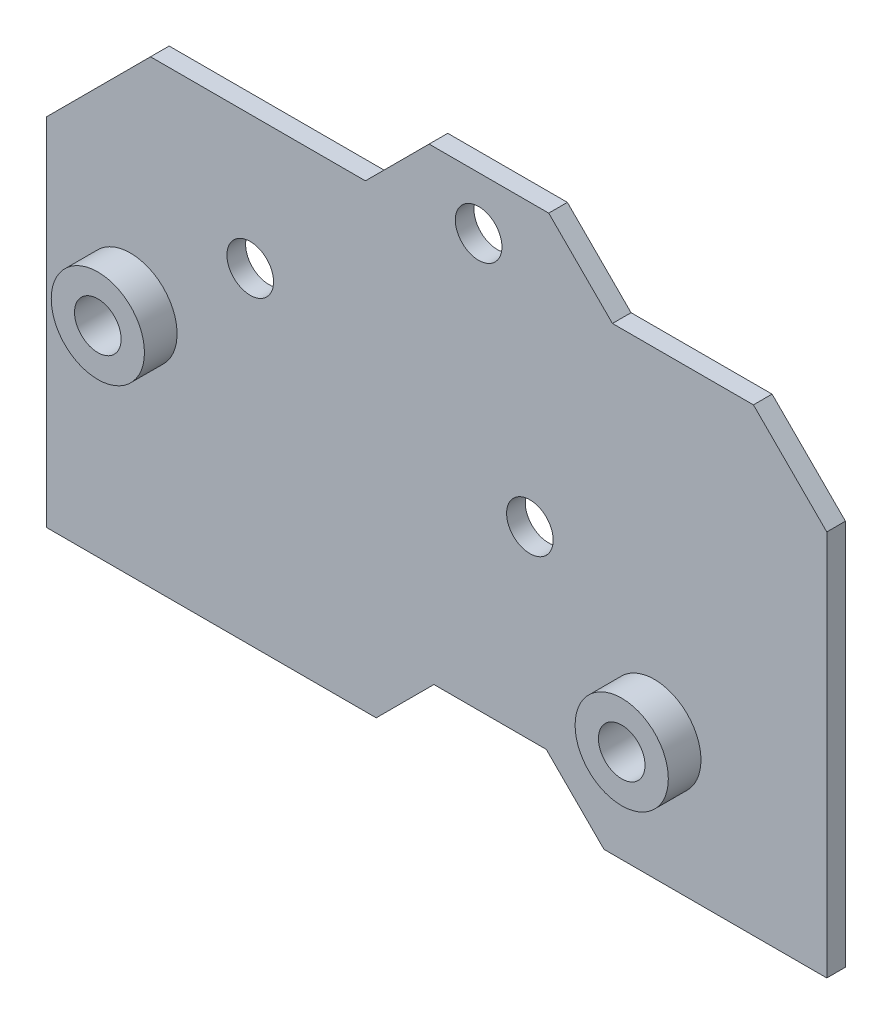
ISO-10303-21;
HEADER;
FILE_DESCRIPTION(('STEP AP214'),'2;1');
FILE_NAME('part.step','',(''),(''),'','','');
FILE_SCHEMA(('AUTOMOTIVE_DESIGN { 1 0 10303 214 1 1 1 1 }'));
ENDSEC;
DATA;
#1=APPLICATION_CONTEXT('core data for automotive mechanical design processes');
#2=APPLICATION_PROTOCOL_DEFINITION('international standard','automotive_design',2000,#1);
#3=PRODUCT_CONTEXT('',#1,'mechanical');
#4=PRODUCT('Part','Part','',(#3));
#5=PRODUCT_RELATED_PRODUCT_CATEGORY('part','',(#4));
#6=PRODUCT_DEFINITION_FORMATION('','',#4);
#7=PRODUCT_DEFINITION_CONTEXT('part definition',#1,'design');
#8=PRODUCT_DEFINITION('design','',#6,#7);
#9=PRODUCT_DEFINITION_SHAPE('','',#8);
#10=(LENGTH_UNIT() NAMED_UNIT(*) SI_UNIT(.MILLI.,.METRE.));
#11=(NAMED_UNIT(*) PLANE_ANGLE_UNIT() SI_UNIT($,.RADIAN.));
#12=(NAMED_UNIT(*) SI_UNIT($,.STERADIAN.) SOLID_ANGLE_UNIT());
#13=UNCERTAINTY_MEASURE_WITH_UNIT(LENGTH_MEASURE(1.E-05),#10,'distance_accuracy_value','');
#14=(GEOMETRIC_REPRESENTATION_CONTEXT(3) GLOBAL_UNCERTAINTY_ASSIGNED_CONTEXT((#13)) GLOBAL_UNIT_ASSIGNED_CONTEXT((#10,
#11,#12)) REPRESENTATION_CONTEXT('',''));
#15=CARTESIAN_POINT('',(0.,0.,0.));
#16=DIRECTION('',(0.,0.,1.));
#17=DIRECTION('',(1.,0.,0.));
#18=AXIS2_PLACEMENT_3D('',#15,#16,#17);
#19=CARTESIAN_POINT('',(0.,0.,2.));
#20=DIRECTION('',(0.,0.,-1.));
#21=DIRECTION('',(-1.,0.,0.));
#22=AXIS2_PLACEMENT_3D('',#19,#20,#21);
#23=PLANE('',#22);
#24=CARTESIAN_POINT('',(23.3494339703597,-14.,2.));
#25=DIRECTION('',(0.,0.,-1.));
#26=DIRECTION('',(-1.,0.,0.));
#27=AXIS2_PLACEMENT_3D('',#24,#25,#26);
#28=CIRCLE('',#27,5.);
#29=CARTESIAN_POINT('',(18.3494339703597,-14.,2.));
#30=VERTEX_POINT('',#29);
#31=EDGE_CURVE('E11',#30,#30,#28,.F.);
#32=ORIENTED_EDGE('',*,*,#31,.F.);
#33=EDGE_LOOP('',(#32));
#34=FACE_BOUND('',#33,.T.);
#35=CARTESIAN_POINT('',(-32.8494339703597,-2.5,2.));
#36=DIRECTION('',(0.,0.,-1.));
#37=DIRECTION('',(-1.,0.,0.));
#38=AXIS2_PLACEMENT_3D('',#35,#36,#37);
#39=CIRCLE('',#38,5.);
#40=CARTESIAN_POINT('',(-37.8494339703597,-2.5,2.));
#41=VERTEX_POINT('',#40);
#42=EDGE_CURVE('E42',#41,#41,#39,.F.);
#43=ORIENTED_EDGE('',*,*,#42,.F.);
#44=EDGE_LOOP('',(#43));
#45=FACE_BOUND('',#44,.T.);
#46=DIRECTION('',(1.,0.,0.));
#47=VECTOR('',#46,1.);
#48=CARTESIAN_POINT('',(17.9485429782925,-27.5,2.));
#49=LINE('',#48,#47);
#50=CARTESIAN_POINT('',(17.9485429782925,-27.5,2.));
#51=VERTEX_POINT('',#50);
#52=CARTESIAN_POINT('',(41.8494339703597,-27.5,2.));
#53=VERTEX_POINT('',#52);
#54=EDGE_CURVE('E194',#51,#53,#49,.T.);
#55=ORIENTED_EDGE('',*,*,#54,.T.);
#56=DIRECTION('',(0.,1.,0.));
#57=VECTOR('',#56,1.);
#58=CARTESIAN_POINT('',(41.8494339703596,13.9419125392165,2.));
#59=LINE('',#58,#57);
#60=CARTESIAN_POINT('',(41.8494339703596,13.9419125392165,2.));
#61=VERTEX_POINT('',#60);
#62=EDGE_CURVE('E112',#53,#61,#59,.T.);
#63=ORIENTED_EDGE('',*,*,#62,.T.);
#64=DIRECTION('',(-0.707106781186549,0.707106781186546,0.));
#65=VECTOR('',#64,1.);
#66=CARTESIAN_POINT('',(33.9794525217825,21.8118939877936,2.));
#67=LINE('',#66,#65);
#68=CARTESIAN_POINT('',(33.9794525217825,21.8118939877936,2.));
#69=VERTEX_POINT('',#68);
#70=EDGE_CURVE('E299',#61,#69,#67,.T.);
#71=ORIENTED_EDGE('',*,*,#70,.T.);
#72=DIRECTION('',(-1.,0.,0.));
#73=VECTOR('',#72,1.);
#74=CARTESIAN_POINT('',(18.8549246288672,21.8118939877936,2.));
#75=LINE('',#74,#73);
#76=CARTESIAN_POINT('',(18.8549246288672,21.8118939877936,2.));
#77=VERTEX_POINT('',#76);
#78=EDGE_CURVE('E311',#69,#77,#75,.T.);
#79=ORIENTED_EDGE('',*,*,#78,.T.);
#80=DIRECTION('',(-0.707106781186555,0.70710678118654,0.));
#81=VECTOR('',#80,1.);
#82=CARTESIAN_POINT('',(12.0209599922633,28.6458586243974,2.));
#83=LINE('',#82,#81);
#84=CARTESIAN_POINT('',(12.0209599922633,28.6458586243974,2.));
#85=VERTEX_POINT('',#84);
#86=EDGE_CURVE('E308',#77,#85,#83,.T.);
#87=ORIENTED_EDGE('',*,*,#86,.T.);
#88=DIRECTION('',(-1.,0.,0.));
#89=VECTOR('',#88,1.);
#90=CARTESIAN_POINT('',(-0.81185065185721,28.6458586243974,2.));
#91=LINE('',#90,#89);
#92=CARTESIAN_POINT('',(-0.81185065185721,28.6458586243974,2.));
#93=VERTEX_POINT('',#92);
#94=EDGE_CURVE('E310',#85,#93,#91,.T.);
#95=ORIENTED_EDGE('',*,*,#94,.T.);
#96=DIRECTION('',(-0.707106781186542,-0.707106781186553,0.));
#97=VECTOR('',#96,1.);
#98=CARTESIAN_POINT('',(-0.81185065185721,28.6458586243974,2.));
#99=LINE('',#98,#97);
#100=CARTESIAN_POINT('',(-7.64581528846089,21.8118939877936,2.));
#101=VERTEX_POINT('',#100);
#102=EDGE_CURVE('E313',#93,#101,#99,.T.);
#103=ORIENTED_EDGE('',*,*,#102,.T.);
#104=DIRECTION('',(-1.,0.,0.));
#105=VECTOR('',#104,1.);
#106=CARTESIAN_POINT('',(-7.64581528846089,21.8118939877936,2.));
#107=LINE('',#106,#105);
#108=CARTESIAN_POINT('',(-30.6985800545319,21.8118939877936,2.));
#109=VERTEX_POINT('',#108);
#110=EDGE_CURVE('E319',#101,#109,#107,.T.);
#111=ORIENTED_EDGE('',*,*,#110,.T.);
#112=DIRECTION('',(-0.707106781186542,-0.707106781186553,0.));
#113=VECTOR('',#112,1.);
#114=CARTESIAN_POINT('',(-30.6985800545319,21.8118939877936,2.));
#115=LINE('',#114,#113);
#116=CARTESIAN_POINT('',(-41.8494339703597,10.6610400719656,2.));
#117=VERTEX_POINT('',#116);
#118=EDGE_CURVE('E321',#109,#117,#115,.T.);
#119=ORIENTED_EDGE('',*,*,#118,.T.);
#120=DIRECTION('',(0.,-1.,0.));
#121=VECTOR('',#120,1.);
#122=CARTESIAN_POINT('',(-41.8494339703597,10.6610400719656,2.));
#123=LINE('',#122,#121);
#124=CARTESIAN_POINT('',(-41.8494339703597,-27.5,2.));
#125=VERTEX_POINT('',#124);
#126=EDGE_CURVE('E323',#117,#125,#123,.T.);
#127=ORIENTED_EDGE('',*,*,#126,.T.);
#128=DIRECTION('',(1.,0.,0.));
#129=VECTOR('',#128,1.);
#130=CARTESIAN_POINT('',(-41.8494339703597,-27.5,2.));
#131=LINE('',#130,#129);
#132=CARTESIAN_POINT('',(-6.48643568895889,-27.5,2.));
#133=VERTEX_POINT('',#132);
#134=EDGE_CURVE('E149',#125,#133,#131,.T.);
#135=ORIENTED_EDGE('',*,*,#134,.T.);
#136=DIRECTION('',(0.707106781186548,0.707106781186548,0.));
#137=VECTOR('',#136,1.);
#138=CARTESIAN_POINT('',(-6.48643568895889,-27.5,2.));
#139=LINE('',#138,#137);
#140=CARTESIAN_POINT('',(-0.294279728037263,-21.3078440390784,2.));
#141=VERTEX_POINT('',#140);
#142=EDGE_CURVE('E143',#133,#141,#139,.T.);
#143=ORIENTED_EDGE('',*,*,#142,.T.);
#144=DIRECTION('',(1.,0.,0.));
#145=VECTOR('',#144,1.);
#146=CARTESIAN_POINT('',(-0.294279728037263,-21.3078440390784,2.));
#147=LINE('',#146,#145);
#148=CARTESIAN_POINT('',(11.7563870173709,-21.3078440390784,2.));
#149=VERTEX_POINT('',#148);
#150=EDGE_CURVE('E147',#141,#149,#147,.T.);
#151=ORIENTED_EDGE('',*,*,#150,.T.);
#152=DIRECTION('',(0.707106781186548,-0.707106781186548,0.));
#153=VECTOR('',#152,1.);
#154=CARTESIAN_POINT('',(11.7563870173709,-21.3078440390784,2.));
#155=LINE('',#154,#153);
#156=EDGE_CURVE('E50',#149,#51,#155,.T.);
#157=ORIENTED_EDGE('',*,*,#156,.T.);
#158=EDGE_LOOP('',(#55,#63,#71,#79,#87,#95,#103,#111,#119,#127,#135,#143,#151,#157));
#159=FACE_BOUND('',#158,.T.);
#160=CARTESIAN_POINT('',(-20.,7.5,2.));
#161=DIRECTION('',(0.,0.,1.));
#162=DIRECTION('',(1.,0.,0.));
#163=AXIS2_PLACEMENT_3D('',#160,#161,#162);
#164=CIRCLE('',#163,2.5);
#165=CARTESIAN_POINT('',(-17.5,7.5,2.));
#166=VERTEX_POINT('',#165);
#167=EDGE_CURVE('E171',#166,#166,#164,.T.);
#168=ORIENTED_EDGE('',*,*,#167,.F.);
#169=EDGE_LOOP('',(#168));
#170=FACE_BOUND('',#169,.T.);
#171=CARTESIAN_POINT('',(4.49999999999999,23.,2.));
#172=DIRECTION('',(0.,0.,1.));
#173=DIRECTION('',(1.,0.,0.));
#174=AXIS2_PLACEMENT_3D('',#171,#172,#173);
#175=CIRCLE('',#174,2.5);
#176=CARTESIAN_POINT('',(6.99999999999999,23.,2.));
#177=VERTEX_POINT('',#176);
#178=EDGE_CURVE('E337',#177,#177,#175,.T.);
#179=ORIENTED_EDGE('',*,*,#178,.F.);
#180=EDGE_LOOP('',(#179));
#181=FACE_BOUND('',#180,.T.);
#182=CARTESIAN_POINT('',(9.99999999999999,-1.5,2.));
#183=DIRECTION('',(0.,0.,1.));
#184=DIRECTION('',(1.,0.,0.));
#185=AXIS2_PLACEMENT_3D('',#182,#183,#184);
#186=CIRCLE('',#185,2.5);
#187=CARTESIAN_POINT('',(12.5,-1.5,2.));
#188=VERTEX_POINT('',#187);
#189=EDGE_CURVE('E343',#188,#188,#186,.T.);
#190=ORIENTED_EDGE('',*,*,#189,.F.);
#191=EDGE_LOOP('',(#190));
#192=FACE_BOUND('',#191,.T.);
#193=ADVANCED_FACE('F33',(#34,#45,#159,#170,#181,#192),#23,.F.);
#194=CARTESIAN_POINT('',(0.,0.,0.));
#195=DIRECTION('',(0.,0.,-1.));
#196=DIRECTION('',(-1.,0.,0.));
#197=AXIS2_PLACEMENT_3D('',#194,#195,#196);
#198=PLANE('',#197);
#199=CARTESIAN_POINT('',(23.3494339703597,-14.,0.));
#200=DIRECTION('',(0.,0.,-1.));
#201=DIRECTION('',(-1.,0.,0.));
#202=AXIS2_PLACEMENT_3D('',#199,#200,#201);
#203=CIRCLE('',#202,2.5);
#204=CARTESIAN_POINT('',(20.8494339703597,-14.,0.));
#205=VERTEX_POINT('',#204);
#206=EDGE_CURVE('E366',#205,#205,#203,.F.);
#207=ORIENTED_EDGE('',*,*,#206,.T.);
#208=EDGE_LOOP('',(#207));
#209=FACE_BOUND('',#208,.T.);
#210=CARTESIAN_POINT('',(-32.8494339703597,-2.5,0.));
#211=DIRECTION('',(0.,0.,-1.));
#212=DIRECTION('',(-1.,0.,0.));
#213=AXIS2_PLACEMENT_3D('',#210,#211,#212);
#214=CIRCLE('',#213,2.49999999999999);
#215=CARTESIAN_POINT('',(-35.3494339703597,-2.5,0.));
#216=VERTEX_POINT('',#215);
#217=EDGE_CURVE('E363',#216,#216,#214,.F.);
#218=ORIENTED_EDGE('',*,*,#217,.T.);
#219=EDGE_LOOP('',(#218));
#220=FACE_BOUND('',#219,.T.);
#221=CARTESIAN_POINT('',(4.49999999999999,23.,0.));
#222=DIRECTION('',(0.,0.,1.));
#223=DIRECTION('',(1.,0.,0.));
#224=AXIS2_PLACEMENT_3D('',#221,#222,#223);
#225=CIRCLE('',#224,2.5);
#226=CARTESIAN_POINT('',(6.99999999999999,23.,0.));
#227=VERTEX_POINT('',#226);
#228=EDGE_CURVE('E340',#227,#227,#225,.T.);
#229=ORIENTED_EDGE('',*,*,#228,.T.);
#230=EDGE_LOOP('',(#229));
#231=FACE_BOUND('',#230,.T.);
#232=DIRECTION('',(1.,0.,0.));
#233=VECTOR('',#232,1.);
#234=CARTESIAN_POINT('',(17.9485429782925,-27.5,0.));
#235=LINE('',#234,#233);
#236=CARTESIAN_POINT('',(17.9485429782925,-27.5,0.));
#237=VERTEX_POINT('',#236);
#238=CARTESIAN_POINT('',(41.8494339703597,-27.5,0.));
#239=VERTEX_POINT('',#238);
#240=EDGE_CURVE('E167',#237,#239,#235,.T.);
#241=ORIENTED_EDGE('',*,*,#240,.F.);
#242=DIRECTION('',(0.707106781186548,-0.707106781186548,0.));
#243=VECTOR('',#242,1.);
#244=CARTESIAN_POINT('',(11.7563870173709,-21.3078440390784,0.));
#245=LINE('',#244,#243);
#246=CARTESIAN_POINT('',(11.7563870173709,-21.3078440390784,0.));
#247=VERTEX_POINT('',#246);
#248=EDGE_CURVE('E103',#247,#237,#245,.T.);
#249=ORIENTED_EDGE('',*,*,#248,.F.);
#250=DIRECTION('',(1.,0.,0.));
#251=VECTOR('',#250,1.);
#252=CARTESIAN_POINT('',(-0.294279728037263,-21.3078440390784,0.));
#253=LINE('',#252,#251);
#254=CARTESIAN_POINT('',(-0.294279728037263,-21.3078440390784,0.));
#255=VERTEX_POINT('',#254);
#256=EDGE_CURVE('E97',#255,#247,#253,.T.);
#257=ORIENTED_EDGE('',*,*,#256,.F.);
#258=DIRECTION('',(0.707106781186548,0.707106781186548,0.));
#259=VECTOR('',#258,1.);
#260=CARTESIAN_POINT('',(-6.48643568895889,-27.5,0.));
#261=LINE('',#260,#259);
#262=CARTESIAN_POINT('',(-6.48643568895889,-27.5,0.));
#263=VERTEX_POINT('',#262);
#264=EDGE_CURVE('E157',#263,#255,#261,.T.);
#265=ORIENTED_EDGE('',*,*,#264,.F.);
#266=DIRECTION('',(1.,0.,0.));
#267=VECTOR('',#266,1.);
#268=CARTESIAN_POINT('',(-41.8494339703597,-27.5,0.));
#269=LINE('',#268,#267);
#270=CARTESIAN_POINT('',(-41.8494339703597,-27.5,0.));
#271=VERTEX_POINT('',#270);
#272=EDGE_CURVE('E189',#271,#263,#269,.T.);
#273=ORIENTED_EDGE('',*,*,#272,.F.);
#274=DIRECTION('',(0.,-1.,0.));
#275=VECTOR('',#274,1.);
#276=CARTESIAN_POINT('',(-41.8494339703597,10.6610400719656,0.));
#277=LINE('',#276,#275);
#278=CARTESIAN_POINT('',(-41.8494339703597,10.6610400719656,0.));
#279=VERTEX_POINT('',#278);
#280=EDGE_CURVE('E187',#279,#271,#277,.T.);
#281=ORIENTED_EDGE('',*,*,#280,.F.);
#282=DIRECTION('',(-0.707106781186542,-0.707106781186553,0.));
#283=VECTOR('',#282,1.);
#284=CARTESIAN_POINT('',(-30.6985800545319,21.8118939877936,0.));
#285=LINE('',#284,#283);
#286=CARTESIAN_POINT('',(-30.6985800545319,21.8118939877936,0.));
#287=VERTEX_POINT('',#286);
#288=EDGE_CURVE('E185',#287,#279,#285,.T.);
#289=ORIENTED_EDGE('',*,*,#288,.F.);
#290=DIRECTION('',(-1.,0.,0.));
#291=VECTOR('',#290,1.);
#292=CARTESIAN_POINT('',(-7.64581528846089,21.8118939877936,0.));
#293=LINE('',#292,#291);
#294=CARTESIAN_POINT('',(-7.64581528846089,21.8118939877936,0.));
#295=VERTEX_POINT('',#294);
#296=EDGE_CURVE('E183',#295,#287,#293,.T.);
#297=ORIENTED_EDGE('',*,*,#296,.F.);
#298=DIRECTION('',(-0.707106781186542,-0.707106781186553,0.));
#299=VECTOR('',#298,1.);
#300=CARTESIAN_POINT('',(-0.81185065185721,28.6458586243974,0.));
#301=LINE('',#300,#299);
#302=CARTESIAN_POINT('',(-0.81185065185721,28.6458586243974,0.));
#303=VERTEX_POINT('',#302);
#304=EDGE_CURVE('E181',#303,#295,#301,.T.);
#305=ORIENTED_EDGE('',*,*,#304,.F.);
#306=DIRECTION('',(-1.,0.,0.));
#307=VECTOR('',#306,1.);
#308=CARTESIAN_POINT('',(-0.81185065185721,28.6458586243974,0.));
#309=LINE('',#308,#307);
#310=CARTESIAN_POINT('',(12.0209599922633,28.6458586243974,0.));
#311=VERTEX_POINT('',#310);
#312=EDGE_CURVE('E179',#311,#303,#309,.T.);
#313=ORIENTED_EDGE('',*,*,#312,.F.);
#314=DIRECTION('',(-0.707106781186555,0.70710678118654,0.));
#315=VECTOR('',#314,1.);
#316=CARTESIAN_POINT('',(12.0209599922633,28.6458586243974,0.));
#317=LINE('',#316,#315);
#318=CARTESIAN_POINT('',(18.8549246288672,21.8118939877936,0.));
#319=VERTEX_POINT('',#318);
#320=EDGE_CURVE('E177',#319,#311,#317,.T.);
#321=ORIENTED_EDGE('',*,*,#320,.F.);
#322=DIRECTION('',(-1.,0.,0.));
#323=VECTOR('',#322,1.);
#324=CARTESIAN_POINT('',(18.8549246288672,21.8118939877936,0.));
#325=LINE('',#324,#323);
#326=CARTESIAN_POINT('',(33.9794525217825,21.8118939877936,0.));
#327=VERTEX_POINT('',#326);
#328=EDGE_CURVE('E175',#327,#319,#325,.T.);
#329=ORIENTED_EDGE('',*,*,#328,.F.);
#330=DIRECTION('',(-0.707106781186549,0.707106781186546,0.));
#331=VECTOR('',#330,1.);
#332=CARTESIAN_POINT('',(33.9794525217825,21.8118939877936,0.));
#333=LINE('',#332,#331);
#334=CARTESIAN_POINT('',(41.8494339703596,13.9419125392165,0.));
#335=VERTEX_POINT('',#334);
#336=EDGE_CURVE('E173',#335,#327,#333,.T.);
#337=ORIENTED_EDGE('',*,*,#336,.F.);
#338=DIRECTION('',(0.,1.,0.));
#339=VECTOR('',#338,1.);
#340=CARTESIAN_POINT('',(41.8494339703596,13.9419125392165,0.));
#341=LINE('',#340,#339);
#342=EDGE_CURVE('E170',#239,#335,#341,.T.);
#343=ORIENTED_EDGE('',*,*,#342,.F.);
#344=EDGE_LOOP('',(#241,#249,#257,#265,#273,#281,#289,#297,#305,#313,#321,#329,#337,#343));
#345=FACE_BOUND('',#344,.T.);
#346=CARTESIAN_POINT('',(-20.,7.5,0.));
#347=DIRECTION('',(0.,0.,1.));
#348=DIRECTION('',(1.,0.,0.));
#349=AXIS2_PLACEMENT_3D('',#346,#347,#348);
#350=CIRCLE('',#349,2.5);
#351=CARTESIAN_POINT('',(-17.5,7.5,0.));
#352=VERTEX_POINT('',#351);
#353=EDGE_CURVE('E334',#352,#352,#350,.T.);
#354=ORIENTED_EDGE('',*,*,#353,.T.);
#355=EDGE_LOOP('',(#354));
#356=FACE_BOUND('',#355,.T.);
#357=CARTESIAN_POINT('',(9.99999999999999,-1.5,0.));
#358=DIRECTION('',(0.,0.,1.));
#359=DIRECTION('',(1.,0.,0.));
#360=AXIS2_PLACEMENT_3D('',#357,#358,#359);
#361=CIRCLE('',#360,2.5);
#362=CARTESIAN_POINT('',(12.5,-1.5,0.));
#363=VERTEX_POINT('',#362);
#364=EDGE_CURVE('E346',#363,#363,#361,.T.);
#365=ORIENTED_EDGE('',*,*,#364,.T.);
#366=EDGE_LOOP('',(#365));
#367=FACE_BOUND('',#366,.T.);
#368=ADVANCED_FACE('F232',(#209,#220,#231,#345,#356,#367),#198,.T.);
#369=CARTESIAN_POINT('',(17.9485429782925,-27.5,2.));
#370=DIRECTION('',(0.,1.,0.));
#371=DIRECTION('',(0.,0.,1.));
#372=AXIS2_PLACEMENT_3D('',#369,#370,#371);
#373=PLANE('',#372);
#374=ORIENTED_EDGE('',*,*,#240,.T.);
#375=DIRECTION('',(0.,0.,-1.));
#376=VECTOR('',#375,1.);
#377=CARTESIAN_POINT('',(41.8494339703597,-27.5,2.));
#378=LINE('',#377,#376);
#379=EDGE_CURVE('E225',#53,#239,#378,.T.);
#380=ORIENTED_EDGE('',*,*,#379,.F.);
#381=ORIENTED_EDGE('',*,*,#54,.F.);
#382=DIRECTION('',(0.,0.,-1.));
#383=VECTOR('',#382,1.);
#384=CARTESIAN_POINT('',(17.9485429782925,-27.5,2.));
#385=LINE('',#384,#383);
#386=EDGE_CURVE('E163',#51,#237,#385,.T.);
#387=ORIENTED_EDGE('',*,*,#386,.T.);
#388=EDGE_LOOP('',(#374,#380,#381,#387));
#389=FACE_BOUND('',#388,.T.);
#390=ADVANCED_FACE('F35',(#389),#373,.F.);
#391=CARTESIAN_POINT('',(41.8494339703596,13.9419125392165,2.));
#392=DIRECTION('',(-1.,0.,0.));
#393=DIRECTION('',(0.,-1.,0.));
#394=AXIS2_PLACEMENT_3D('',#391,#392,#393);
#395=PLANE('',#394);
#396=ORIENTED_EDGE('',*,*,#342,.T.);
#397=DIRECTION('',(0.,0.,-1.));
#398=VECTOR('',#397,1.);
#399=CARTESIAN_POINT('',(41.8494339703596,13.9419125392165,2.));
#400=LINE('',#399,#398);
#401=EDGE_CURVE('E222',#61,#335,#400,.T.);
#402=ORIENTED_EDGE('',*,*,#401,.F.);
#403=ORIENTED_EDGE('',*,*,#62,.F.);
#404=ORIENTED_EDGE('',*,*,#379,.T.);
#405=EDGE_LOOP('',(#396,#402,#403,#404));
#406=FACE_BOUND('',#405,.T.);
#407=ADVANCED_FACE('F286',(#406),#395,.F.);
#408=CARTESIAN_POINT('',(33.9794525217825,21.8118939877936,2.));
#409=DIRECTION('',(-0.707106781186546,-0.707106781186549,0.));
#410=DIRECTION('',(0.707106781186549,-0.707106781186546,0.));
#411=AXIS2_PLACEMENT_3D('',#408,#409,#410);
#412=PLANE('',#411);
#413=ORIENTED_EDGE('',*,*,#336,.T.);
#414=DIRECTION('',(0.,0.,-1.));
#415=VECTOR('',#414,1.);
#416=CARTESIAN_POINT('',(33.9794525217825,21.8118939877936,2.));
#417=LINE('',#416,#415);
#418=EDGE_CURVE('E219',#69,#327,#417,.T.);
#419=ORIENTED_EDGE('',*,*,#418,.F.);
#420=ORIENTED_EDGE('',*,*,#70,.F.);
#421=ORIENTED_EDGE('',*,*,#401,.T.);
#422=EDGE_LOOP('',(#413,#419,#420,#421));
#423=FACE_BOUND('',#422,.T.);
#424=ADVANCED_FACE('F283',(#423),#412,.F.);
#425=CARTESIAN_POINT('',(18.8549246288672,21.8118939877936,2.));
#426=DIRECTION('',(0.,-1.,0.));
#427=DIRECTION('',(0.,0.,-1.));
#428=AXIS2_PLACEMENT_3D('',#425,#426,#427);
#429=PLANE('',#428);
#430=ORIENTED_EDGE('',*,*,#328,.T.);
#431=DIRECTION('',(0.,0.,-1.));
#432=VECTOR('',#431,1.);
#433=CARTESIAN_POINT('',(18.8549246288672,21.8118939877936,2.));
#434=LINE('',#433,#432);
#435=EDGE_CURVE('E216',#77,#319,#434,.T.);
#436=ORIENTED_EDGE('',*,*,#435,.F.);
#437=ORIENTED_EDGE('',*,*,#78,.F.);
#438=ORIENTED_EDGE('',*,*,#418,.T.);
#439=EDGE_LOOP('',(#430,#436,#437,#438));
#440=FACE_BOUND('',#439,.T.);
#441=ADVANCED_FACE('F279',(#440),#429,.F.);
#442=CARTESIAN_POINT('',(12.0209599922633,28.6458586243974,2.));
#443=DIRECTION('',(-0.70710678118654,-0.707106781186555,0.));
#444=DIRECTION('',(0.707106781186555,-0.70710678118654,0.));
#445=AXIS2_PLACEMENT_3D('',#442,#443,#444);
#446=PLANE('',#445);
#447=ORIENTED_EDGE('',*,*,#320,.T.);
#448=DIRECTION('',(0.,0.,-1.));
#449=VECTOR('',#448,1.);
#450=CARTESIAN_POINT('',(12.0209599922633,28.6458586243974,2.));
#451=LINE('',#450,#449);
#452=EDGE_CURVE('E213',#85,#311,#451,.T.);
#453=ORIENTED_EDGE('',*,*,#452,.F.);
#454=ORIENTED_EDGE('',*,*,#86,.F.);
#455=ORIENTED_EDGE('',*,*,#435,.T.);
#456=EDGE_LOOP('',(#447,#453,#454,#455));
#457=FACE_BOUND('',#456,.T.);
#458=ADVANCED_FACE('F275',(#457),#446,.F.);
#459=CARTESIAN_POINT('',(-0.81185065185721,28.6458586243974,2.));
#460=DIRECTION('',(0.,-1.,0.));
#461=DIRECTION('',(0.,0.,-1.));
#462=AXIS2_PLACEMENT_3D('',#459,#460,#461);
#463=PLANE('',#462);
#464=ORIENTED_EDGE('',*,*,#312,.T.);
#465=DIRECTION('',(0.,0.,-1.));
#466=VECTOR('',#465,1.);
#467=CARTESIAN_POINT('',(-0.81185065185721,28.6458586243974,2.));
#468=LINE('',#467,#466);
#469=EDGE_CURVE('E210',#93,#303,#468,.T.);
#470=ORIENTED_EDGE('',*,*,#469,.F.);
#471=ORIENTED_EDGE('',*,*,#94,.F.);
#472=ORIENTED_EDGE('',*,*,#452,.T.);
#473=EDGE_LOOP('',(#464,#470,#471,#472));
#474=FACE_BOUND('',#473,.T.);
#475=ADVANCED_FACE('F271',(#474),#463,.F.);
#476=CARTESIAN_POINT('',(-0.81185065185721,28.6458586243974,2.));
#477=DIRECTION('',(0.707106781186553,-0.707106781186543,0.));
#478=DIRECTION('',(0.707106781186543,0.707106781186553,0.));
#479=AXIS2_PLACEMENT_3D('',#476,#477,#478);
#480=PLANE('',#479);
#481=ORIENTED_EDGE('',*,*,#304,.T.);
#482=DIRECTION('',(0.,0.,-1.));
#483=VECTOR('',#482,1.);
#484=CARTESIAN_POINT('',(-7.64581528846089,21.8118939877936,2.));
#485=LINE('',#484,#483);
#486=EDGE_CURVE('E207',#101,#295,#485,.T.);
#487=ORIENTED_EDGE('',*,*,#486,.F.);
#488=ORIENTED_EDGE('',*,*,#102,.F.);
#489=ORIENTED_EDGE('',*,*,#469,.T.);
#490=EDGE_LOOP('',(#481,#487,#488,#489));
#491=FACE_BOUND('',#490,.T.);
#492=ADVANCED_FACE('F267',(#491),#480,.F.);
#493=CARTESIAN_POINT('',(-7.64581528846089,21.8118939877936,2.));
#494=DIRECTION('',(0.,-1.,0.));
#495=DIRECTION('',(0.,0.,-1.));
#496=AXIS2_PLACEMENT_3D('',#493,#494,#495);
#497=PLANE('',#496);
#498=ORIENTED_EDGE('',*,*,#296,.T.);
#499=DIRECTION('',(0.,0.,-1.));
#500=VECTOR('',#499,1.);
#501=CARTESIAN_POINT('',(-30.6985800545319,21.8118939877936,2.));
#502=LINE('',#501,#500);
#503=EDGE_CURVE('E204',#109,#287,#502,.T.);
#504=ORIENTED_EDGE('',*,*,#503,.F.);
#505=ORIENTED_EDGE('',*,*,#110,.F.);
#506=ORIENTED_EDGE('',*,*,#486,.T.);
#507=EDGE_LOOP('',(#498,#504,#505,#506));
#508=FACE_BOUND('',#507,.T.);
#509=ADVANCED_FACE('F263',(#508),#497,.F.);
#510=CARTESIAN_POINT('',(-30.6985800545319,21.8118939877936,2.));
#511=DIRECTION('',(0.707106781186553,-0.707106781186542,0.));
#512=DIRECTION('',(0.707106781186542,0.707106781186553,0.));
#513=AXIS2_PLACEMENT_3D('',#510,#511,#512);
#514=PLANE('',#513);
#515=ORIENTED_EDGE('',*,*,#288,.T.);
#516=DIRECTION('',(0.,0.,-1.));
#517=VECTOR('',#516,1.);
#518=CARTESIAN_POINT('',(-41.8494339703597,10.6610400719656,2.));
#519=LINE('',#518,#517);
#520=EDGE_CURVE('E201',#117,#279,#519,.T.);
#521=ORIENTED_EDGE('',*,*,#520,.F.);
#522=ORIENTED_EDGE('',*,*,#118,.F.);
#523=ORIENTED_EDGE('',*,*,#503,.T.);
#524=EDGE_LOOP('',(#515,#521,#522,#523));
#525=FACE_BOUND('',#524,.T.);
#526=ADVANCED_FACE('F259',(#525),#514,.F.);
#527=CARTESIAN_POINT('',(-41.8494339703597,10.6610400719656,2.));
#528=DIRECTION('',(1.,0.,0.));
#529=DIRECTION('',(0.,1.,0.));
#530=AXIS2_PLACEMENT_3D('',#527,#528,#529);
#531=PLANE('',#530);
#532=ORIENTED_EDGE('',*,*,#280,.T.);
#533=DIRECTION('',(0.,0.,-1.));
#534=VECTOR('',#533,1.);
#535=CARTESIAN_POINT('',(-41.8494339703597,-27.5,2.));
#536=LINE('',#535,#534);
#537=EDGE_CURVE('E198',#125,#271,#536,.T.);
#538=ORIENTED_EDGE('',*,*,#537,.F.);
#539=ORIENTED_EDGE('',*,*,#126,.F.);
#540=ORIENTED_EDGE('',*,*,#520,.T.);
#541=EDGE_LOOP('',(#532,#538,#539,#540));
#542=FACE_BOUND('',#541,.T.);
#543=ADVANCED_FACE('F255',(#542),#531,.F.);
#544=CARTESIAN_POINT('',(-41.8494339703597,-27.5,2.));
#545=DIRECTION('',(0.,1.,0.));
#546=DIRECTION('',(0.,0.,1.));
#547=AXIS2_PLACEMENT_3D('',#544,#545,#546);
#548=PLANE('',#547);
#549=ORIENTED_EDGE('',*,*,#272,.T.);
#550=DIRECTION('',(0.,0.,-1.));
#551=VECTOR('',#550,1.);
#552=CARTESIAN_POINT('',(-6.48643568895889,-27.5,2.));
#553=LINE('',#552,#551);
#554=EDGE_CURVE('E158',#133,#263,#553,.T.);
#555=ORIENTED_EDGE('',*,*,#554,.F.);
#556=ORIENTED_EDGE('',*,*,#134,.F.);
#557=ORIENTED_EDGE('',*,*,#537,.T.);
#558=EDGE_LOOP('',(#549,#555,#556,#557));
#559=FACE_BOUND('',#558,.T.);
#560=ADVANCED_FACE('F252',(#559),#548,.F.);
#561=CARTESIAN_POINT('',(-6.48643568895889,-27.5,2.));
#562=DIRECTION('',(-0.707106781186547,0.707106781186547,0.));
#563=DIRECTION('',(-0.707106781186548,-0.707106781186548,0.));
#564=AXIS2_PLACEMENT_3D('',#561,#562,#563);
#565=PLANE('',#564);
#566=ORIENTED_EDGE('',*,*,#264,.T.);
#567=DIRECTION('',(0.,0.,-1.));
#568=VECTOR('',#567,1.);
#569=CARTESIAN_POINT('',(-0.294279728037263,-21.3078440390784,2.));
#570=LINE('',#569,#568);
#571=EDGE_CURVE('E154',#141,#255,#570,.T.);
#572=ORIENTED_EDGE('',*,*,#571,.F.);
#573=ORIENTED_EDGE('',*,*,#142,.F.);
#574=ORIENTED_EDGE('',*,*,#554,.T.);
#575=EDGE_LOOP('',(#566,#572,#573,#574));
#576=FACE_BOUND('',#575,.T.);
#577=ADVANCED_FACE('F155',(#576),#565,.F.);
#578=CARTESIAN_POINT('',(-0.294279728037263,-21.3078440390784,2.));
#579=DIRECTION('',(0.,1.,0.));
#580=DIRECTION('',(0.,0.,1.));
#581=AXIS2_PLACEMENT_3D('',#578,#579,#580);
#582=PLANE('',#581);
#583=ORIENTED_EDGE('',*,*,#256,.T.);
#584=DIRECTION('',(0.,0.,-1.));
#585=VECTOR('',#584,1.);
#586=CARTESIAN_POINT('',(11.7563870173709,-21.3078440390784,2.));
#587=LINE('',#586,#585);
#588=EDGE_CURVE('E159',#149,#247,#587,.T.);
#589=ORIENTED_EDGE('',*,*,#588,.F.);
#590=ORIENTED_EDGE('',*,*,#150,.F.);
#591=ORIENTED_EDGE('',*,*,#571,.T.);
#592=EDGE_LOOP('',(#583,#589,#590,#591));
#593=FACE_BOUND('',#592,.T.);
#594=ADVANCED_FACE('F161',(#593),#582,.F.);
#595=CARTESIAN_POINT('',(11.7563870173709,-21.3078440390784,2.));
#596=DIRECTION('',(0.707106781186547,0.707106781186547,0.));
#597=DIRECTION('',(-0.707106781186548,0.707106781186548,0.));
#598=AXIS2_PLACEMENT_3D('',#595,#596,#597);
#599=PLANE('',#598);
#600=ORIENTED_EDGE('',*,*,#248,.T.);
#601=ORIENTED_EDGE('',*,*,#386,.F.);
#602=ORIENTED_EDGE('',*,*,#156,.F.);
#603=ORIENTED_EDGE('',*,*,#588,.T.);
#604=EDGE_LOOP('',(#600,#601,#602,#603));
#605=FACE_BOUND('',#604,.T.);
#606=ADVANCED_FACE('F245',(#605),#599,.F.);
#607=CARTESIAN_POINT('',(-20.,7.5,2.));
#608=DIRECTION('',(0.,0.,-1.));
#609=DIRECTION('',(-1.,0.,0.));
#610=AXIS2_PLACEMENT_3D('',#607,#608,#609);
#611=CYLINDRICAL_SURFACE('',#610,2.5);
#612=ORIENTED_EDGE('',*,*,#167,.T.);
#613=EDGE_LOOP('',(#612));
#614=FACE_BOUND('',#613,.T.);
#615=ORIENTED_EDGE('',*,*,#353,.F.);
#616=EDGE_LOOP('',(#615));
#617=FACE_BOUND('',#616,.T.);
#618=ADVANCED_FACE('F242',(#614,#617),#611,.F.);
#619=CARTESIAN_POINT('',(4.49999999999999,23.,2.));
#620=DIRECTION('',(0.,0.,-1.));
#621=DIRECTION('',(-1.,0.,0.));
#622=AXIS2_PLACEMENT_3D('',#619,#620,#621);
#623=CYLINDRICAL_SURFACE('',#622,2.5);
#624=ORIENTED_EDGE('',*,*,#178,.T.);
#625=EDGE_LOOP('',(#624));
#626=FACE_BOUND('',#625,.T.);
#627=ORIENTED_EDGE('',*,*,#228,.F.);
#628=EDGE_LOOP('',(#627));
#629=FACE_BOUND('',#628,.T.);
#630=ADVANCED_FACE('F399',(#626,#629),#623,.F.);
#631=CARTESIAN_POINT('',(9.99999999999999,-1.5,2.));
#632=DIRECTION('',(0.,0.,-1.));
#633=DIRECTION('',(-1.,0.,0.));
#634=AXIS2_PLACEMENT_3D('',#631,#632,#633);
#635=CYLINDRICAL_SURFACE('',#634,2.5);
#636=ORIENTED_EDGE('',*,*,#189,.T.);
#637=EDGE_LOOP('',(#636));
#638=FACE_BOUND('',#637,.T.);
#639=ORIENTED_EDGE('',*,*,#364,.F.);
#640=EDGE_LOOP('',(#639));
#641=FACE_BOUND('',#640,.T.);
#642=ADVANCED_FACE('F393',(#638,#641),#635,.F.);
#643=CARTESIAN_POINT('',(-32.8494339703597,-2.5,5.5));
#644=DIRECTION('',(0.,0.,1.));
#645=DIRECTION('',(1.,0.,0.));
#646=AXIS2_PLACEMENT_3D('',#643,#644,#645);
#647=PLANE('',#646);
#648=CARTESIAN_POINT('',(-32.8494339703597,-2.5,5.5));
#649=DIRECTION('',(0.,0.,1.));
#650=DIRECTION('',(1.,0.,0.));
#651=AXIS2_PLACEMENT_3D('',#648,#649,#650);
#652=CIRCLE('',#651,5.);
#653=CARTESIAN_POINT('',(-27.8494339703597,-2.5,5.5));
#654=VERTEX_POINT('',#653);
#655=EDGE_CURVE('E349',#654,#654,#652,.T.);
#656=ORIENTED_EDGE('',*,*,#655,.T.);
#657=EDGE_LOOP('',(#656));
#658=FACE_BOUND('',#657,.T.);
#659=CARTESIAN_POINT('',(-32.8494339703597,-2.5,5.5));
#660=DIRECTION('',(0.,0.,1.));
#661=DIRECTION('',(1.,0.,0.));
#662=AXIS2_PLACEMENT_3D('',#659,#660,#661);
#663=CIRCLE('',#662,2.49999999999999);
#664=CARTESIAN_POINT('',(-30.3494339703597,-2.5,5.5));
#665=VERTEX_POINT('',#664);
#666=EDGE_CURVE('E354',#665,#665,#663,.T.);
#667=ORIENTED_EDGE('',*,*,#666,.F.);
#668=EDGE_LOOP('',(#667));
#669=FACE_BOUND('',#668,.T.);
#670=ADVANCED_FACE('F390',(#658,#669),#647,.T.);
#671=CARTESIAN_POINT('',(-32.8494339703597,-2.5,5.5));
#672=DIRECTION('',(0.,0.,-1.));
#673=DIRECTION('',(-1.,0.,0.));
#674=AXIS2_PLACEMENT_3D('',#671,#672,#673);
#675=CYLINDRICAL_SURFACE('',#674,5.);
#676=ORIENTED_EDGE('',*,*,#655,.F.);
#677=EDGE_LOOP('',(#676));
#678=FACE_BOUND('',#677,.T.);
#679=ORIENTED_EDGE('',*,*,#42,.T.);
#680=EDGE_LOOP('',(#679));
#681=FACE_BOUND('',#680,.T.);
#682=ADVANCED_FACE('F229',(#678,#681),#675,.T.);
#683=CARTESIAN_POINT('',(-32.8494339703597,-2.5,5.5));
#684=DIRECTION('',(0.,0.,-1.));
#685=DIRECTION('',(-1.,0.,0.));
#686=AXIS2_PLACEMENT_3D('',#683,#684,#685);
#687=CYLINDRICAL_SURFACE('',#686,2.49999999999999);
#688=ORIENTED_EDGE('',*,*,#666,.T.);
#689=EDGE_LOOP('',(#688));
#690=FACE_BOUND('',#689,.T.);
#691=ORIENTED_EDGE('',*,*,#217,.F.);
#692=EDGE_LOOP('',(#691));
#693=FACE_BOUND('',#692,.T.);
#694=ADVANCED_FACE('F384',(#690,#693),#687,.F.);
#695=CARTESIAN_POINT('',(23.3494339703597,-14.,5.5));
#696=DIRECTION('',(0.,0.,1.));
#697=DIRECTION('',(1.,0.,0.));
#698=AXIS2_PLACEMENT_3D('',#695,#696,#697);
#699=PLANE('',#698);
#700=CARTESIAN_POINT('',(23.3494339703597,-14.,5.5));
#701=DIRECTION('',(0.,0.,1.));
#702=DIRECTION('',(1.,0.,0.));
#703=AXIS2_PLACEMENT_3D('',#700,#701,#702);
#704=CIRCLE('',#703,5.);
#705=CARTESIAN_POINT('',(28.3494339703597,-14.,5.5));
#706=VERTEX_POINT('',#705);
#707=EDGE_CURVE('E357',#706,#706,#704,.T.);
#708=ORIENTED_EDGE('',*,*,#707,.T.);
#709=EDGE_LOOP('',(#708));
#710=FACE_BOUND('',#709,.T.);
#711=CARTESIAN_POINT('',(23.3494339703597,-14.,5.5));
#712=DIRECTION('',(0.,0.,1.));
#713=DIRECTION('',(1.,0.,0.));
#714=AXIS2_PLACEMENT_3D('',#711,#712,#713);
#715=CIRCLE('',#714,2.5);
#716=CARTESIAN_POINT('',(25.8494339703597,-14.,5.5));
#717=VERTEX_POINT('',#716);
#718=EDGE_CURVE('E360',#717,#717,#715,.T.);
#719=ORIENTED_EDGE('',*,*,#718,.F.);
#720=EDGE_LOOP('',(#719));
#721=FACE_BOUND('',#720,.T.);
#722=ADVANCED_FACE('F379',(#710,#721),#699,.T.);
#723=CARTESIAN_POINT('',(23.3494339703597,-14.,5.5));
#724=DIRECTION('',(0.,0.,-1.));
#725=DIRECTION('',(-1.,0.,0.));
#726=AXIS2_PLACEMENT_3D('',#723,#724,#725);
#727=CYLINDRICAL_SURFACE('',#726,5.);
#728=ORIENTED_EDGE('',*,*,#707,.F.);
#729=EDGE_LOOP('',(#728));
#730=FACE_BOUND('',#729,.T.);
#731=ORIENTED_EDGE('',*,*,#31,.T.);
#732=EDGE_LOOP('',(#731));
#733=FACE_BOUND('',#732,.T.);
#734=ADVANCED_FACE('F373',(#730,#733),#727,.T.);
#735=CARTESIAN_POINT('',(23.3494339703597,-14.,5.5));
#736=DIRECTION('',(0.,0.,-1.));
#737=DIRECTION('',(-1.,0.,0.));
#738=AXIS2_PLACEMENT_3D('',#735,#736,#737);
#739=CYLINDRICAL_SURFACE('',#738,2.5);
#740=ORIENTED_EDGE('',*,*,#718,.T.);
#741=EDGE_LOOP('',(#740));
#742=FACE_BOUND('',#741,.T.);
#743=ORIENTED_EDGE('',*,*,#206,.F.);
#744=EDGE_LOOP('',(#743));
#745=FACE_BOUND('',#744,.T.);
#746=ADVANCED_FACE('F371',(#742,#745),#739,.F.);
#747=CLOSED_SHELL('',(#193,#368,#390,#407,#424,#441,#458,#475,#492,#509,#526,#543,#560,#577,
#594,#606,#618,#630,#642,#670,#682,#694,#722,#734,#746));
#748=MANIFOLD_SOLID_BREP('B2',#747);
#749=ADVANCED_BREP_SHAPE_REPRESENTATION('',(#18,#748),#14);
#750=SHAPE_DEFINITION_REPRESENTATION(#9,#749);
ENDSEC;
END-ISO-10303-21;
